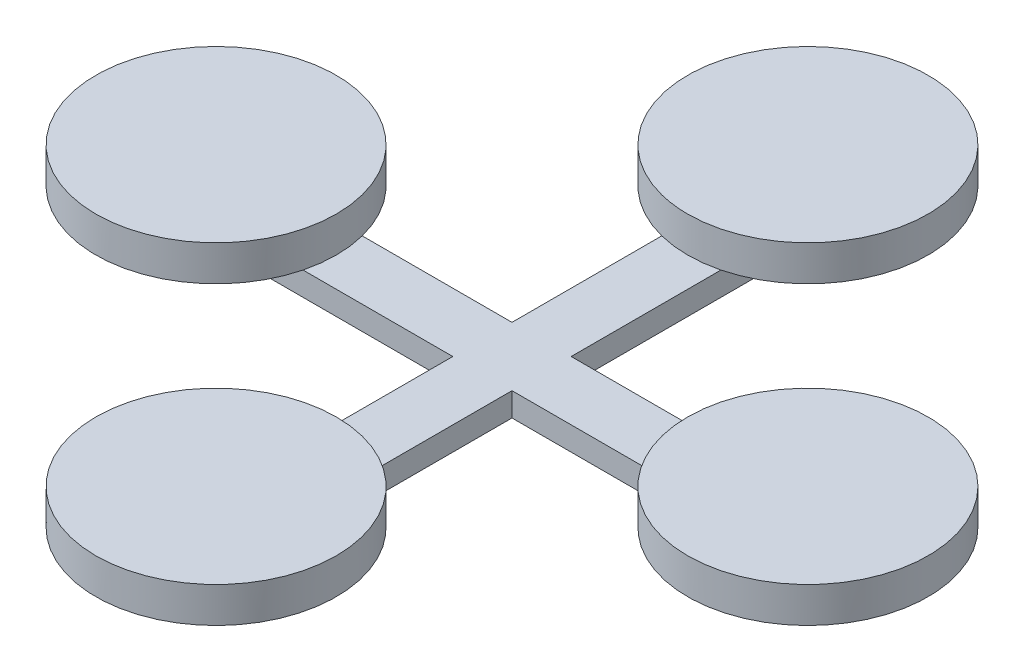
ISO-10303-21;
HEADER;
FILE_DESCRIPTION(('STEP AP214'),'2;1');
FILE_NAME('part.step','',(''),(''),'','','');
FILE_SCHEMA(('AUTOMOTIVE_DESIGN { 1 0 10303 214 1 1 1 1 }'));
ENDSEC;
DATA;
#1=APPLICATION_CONTEXT('core data for automotive mechanical design processes');
#2=APPLICATION_PROTOCOL_DEFINITION('international standard','automotive_design',2000,#1);
#3=PRODUCT_CONTEXT('',#1,'mechanical');
#4=PRODUCT('Part','Part','',(#3));
#5=PRODUCT_RELATED_PRODUCT_CATEGORY('part','',(#4));
#6=PRODUCT_DEFINITION_FORMATION('','',#4);
#7=PRODUCT_DEFINITION_CONTEXT('part definition',#1,'design');
#8=PRODUCT_DEFINITION('design','',#6,#7);
#9=PRODUCT_DEFINITION_SHAPE('','',#8);
#10=(LENGTH_UNIT() NAMED_UNIT(*) SI_UNIT(.MILLI.,.METRE.));
#11=(NAMED_UNIT(*) PLANE_ANGLE_UNIT() SI_UNIT($,.RADIAN.));
#12=(NAMED_UNIT(*) SI_UNIT($,.STERADIAN.) SOLID_ANGLE_UNIT());
#13=UNCERTAINTY_MEASURE_WITH_UNIT(LENGTH_MEASURE(1.E-05),#10,'distance_accuracy_value','');
#14=(GEOMETRIC_REPRESENTATION_CONTEXT(3) GLOBAL_UNCERTAINTY_ASSIGNED_CONTEXT((#13)) GLOBAL_UNIT_ASSIGNED_CONTEXT((#10,
#11,#12)) REPRESENTATION_CONTEXT('',''));
#15=CARTESIAN_POINT('',(0.,0.,0.));
#16=DIRECTION('',(0.,0.,1.));
#17=DIRECTION('',(1.,0.,0.));
#18=AXIS2_PLACEMENT_3D('',#15,#16,#17);
#19=CARTESIAN_POINT('',(-12.5,10.,0.));
#20=DIRECTION('',(1.,0.,0.));
#21=DIRECTION('',(0.,0.,-1.));
#22=AXIS2_PLACEMENT_3D('',#19,#20,#21);
#23=PLANE('',#22);
#24=DIRECTION('',(0.,0.,1.));
#25=VECTOR('',#24,1.);
#26=CARTESIAN_POINT('',(-12.5,0.,0.));
#27=LINE('',#26,#25);
#28=CARTESIAN_POINT('',(-12.5,0.,-125.));
#29=VERTEX_POINT('',#28);
#30=CARTESIAN_POINT('',(-12.5,0.,-12.5));
#31=VERTEX_POINT('',#30);
#32=EDGE_CURVE('E227',#29,#31,#27,.T.);
#33=ORIENTED_EDGE('',*,*,#32,.T.);
#34=DIRECTION('',(0.,-1.,0.));
#35=VECTOR('',#34,1.);
#36=CARTESIAN_POINT('',(-12.5,10.,-12.5));
#37=LINE('',#36,#35);
#38=CARTESIAN_POINT('',(-12.5,10.,-12.5));
#39=VERTEX_POINT('',#38);
#40=EDGE_CURVE('E42',#39,#31,#37,.T.);
#41=ORIENTED_EDGE('',*,*,#40,.F.);
#42=DIRECTION('',(0.,0.,1.));
#43=VECTOR('',#42,1.);
#44=CARTESIAN_POINT('',(-12.5,10.,0.));
#45=LINE('',#44,#43);
#46=CARTESIAN_POINT('',(-12.5,10.,-75.761904992171));
#47=VERTEX_POINT('',#46);
#48=EDGE_CURVE('E172',#47,#39,#45,.T.);
#49=ORIENTED_EDGE('',*,*,#48,.F.);
#50=CARTESIAN_POINT('',(-12.5,10.,-125.));
#51=VERTEX_POINT('',#50);
#52=EDGE_CURVE('E176',#51,#47,#45,.T.);
#53=ORIENTED_EDGE('',*,*,#52,.F.);
#54=DIRECTION('',(0.,-1.,0.));
#55=VECTOR('',#54,1.);
#56=CARTESIAN_POINT('',(-12.5,10.,-125.));
#57=LINE('',#56,#55);
#58=EDGE_CURVE('E226',#51,#29,#57,.T.);
#59=ORIENTED_EDGE('',*,*,#58,.T.);
#60=EDGE_LOOP('',(#33,#41,#49,#53,#59));
#61=FACE_BOUND('',#60,.T.);
#62=ADVANCED_FACE('F39',(#61),#23,.F.);
#63=CARTESIAN_POINT('',(0.,10.,-12.5));
#64=DIRECTION('',(0.,0.,-1.));
#65=DIRECTION('',(-1.,0.,0.));
#66=AXIS2_PLACEMENT_3D('',#63,#64,#65);
#67=PLANE('',#66);
#68=DIRECTION('',(1.,0.,0.));
#69=VECTOR('',#68,1.);
#70=CARTESIAN_POINT('',(0.,0.,-12.5));
#71=LINE('',#70,#69);
#72=CARTESIAN_POINT('',(-125.,0.,-12.5));
#73=VERTEX_POINT('',#72);
#74=EDGE_CURVE('E231',#73,#31,#71,.T.);
#75=ORIENTED_EDGE('',*,*,#74,.F.);
#76=DIRECTION('',(0.,-1.,0.));
#77=VECTOR('',#76,1.);
#78=CARTESIAN_POINT('',(-125.,10.,-12.5));
#79=LINE('',#78,#77);
#80=CARTESIAN_POINT('',(-125.,10.,-12.5));
#81=VERTEX_POINT('',#80);
#82=EDGE_CURVE('E180',#81,#73,#79,.T.);
#83=ORIENTED_EDGE('',*,*,#82,.F.);
#84=DIRECTION('',(1.,0.,0.));
#85=VECTOR('',#84,1.);
#86=CARTESIAN_POINT('',(0.,10.,-12.5));
#87=LINE('',#86,#85);
#88=CARTESIAN_POINT('',(-75.7619049921706,10.,-12.5));
#89=VERTEX_POINT('',#88);
#90=EDGE_CURVE('E154',#81,#89,#87,.T.);
#91=ORIENTED_EDGE('',*,*,#90,.T.);
#92=EDGE_CURVE('E169',#89,#39,#87,.T.);
#93=ORIENTED_EDGE('',*,*,#92,.T.);
#94=ORIENTED_EDGE('',*,*,#40,.T.);
#95=EDGE_LOOP('',(#75,#83,#91,#93,#94));
#96=FACE_BOUND('',#95,.T.);
#97=ADVANCED_FACE('F179',(#96),#67,.T.);
#98=CARTESIAN_POINT('',(-125.,10.,0.));
#99=DIRECTION('',(1.,0.,0.));
#100=DIRECTION('',(0.,0.,-1.));
#101=AXIS2_PLACEMENT_3D('',#98,#99,#100);
#102=PLANE('',#101);
#103=DIRECTION('',(0.,0.,1.));
#104=VECTOR('',#103,1.);
#105=CARTESIAN_POINT('',(-125.,0.,0.));
#106=LINE('',#105,#104);
#107=CARTESIAN_POINT('',(-125.,0.,12.5));
#108=VERTEX_POINT('',#107);
#109=EDGE_CURVE('E236',#73,#108,#106,.T.);
#110=ORIENTED_EDGE('',*,*,#109,.T.);
#111=DIRECTION('',(0.,-1.,0.));
#112=VECTOR('',#111,1.);
#113=CARTESIAN_POINT('',(-125.,10.,12.5));
#114=LINE('',#113,#112);
#115=CARTESIAN_POINT('',(-125.,10.,12.5));
#116=VERTEX_POINT('',#115);
#117=EDGE_CURVE('E301',#116,#108,#114,.T.);
#118=ORIENTED_EDGE('',*,*,#117,.F.);
#119=DIRECTION('',(0.,0.,1.));
#120=VECTOR('',#119,1.);
#121=CARTESIAN_POINT('',(-125.,10.,0.));
#122=LINE('',#121,#120);
#123=EDGE_CURVE('E183',#81,#116,#122,.T.);
#124=ORIENTED_EDGE('',*,*,#123,.F.);
#125=ORIENTED_EDGE('',*,*,#82,.T.);
#126=EDGE_LOOP('',(#110,#118,#124,#125));
#127=FACE_BOUND('',#126,.T.);
#128=ADVANCED_FACE('F317',(#127),#102,.F.);
#129=CARTESIAN_POINT('',(0.,10.,12.5));
#130=DIRECTION('',(0.,0.,-1.));
#131=DIRECTION('',(-1.,0.,0.));
#132=AXIS2_PLACEMENT_3D('',#129,#130,#131);
#133=PLANE('',#132);
#134=DIRECTION('',(1.,0.,0.));
#135=VECTOR('',#134,1.);
#136=CARTESIAN_POINT('',(0.,0.,12.5));
#137=LINE('',#136,#135);
#138=CARTESIAN_POINT('',(-12.5,0.,12.5));
#139=VERTEX_POINT('',#138);
#140=EDGE_CURVE('E239',#108,#139,#137,.T.);
#141=ORIENTED_EDGE('',*,*,#140,.T.);
#142=DIRECTION('',(0.,-1.,0.));
#143=VECTOR('',#142,1.);
#144=CARTESIAN_POINT('',(-12.5,10.,12.5));
#145=LINE('',#144,#143);
#146=CARTESIAN_POINT('',(-12.5,10.,12.5));
#147=VERTEX_POINT('',#146);
#148=EDGE_CURVE('E297',#147,#139,#145,.T.);
#149=ORIENTED_EDGE('',*,*,#148,.F.);
#150=DIRECTION('',(1.,0.,0.));
#151=VECTOR('',#150,1.);
#152=CARTESIAN_POINT('',(0.,10.,12.5));
#153=LINE('',#152,#151);
#154=CARTESIAN_POINT('',(-75.7619049921713,10.,12.5));
#155=VERTEX_POINT('',#154);
#156=EDGE_CURVE('E185',#155,#147,#153,.T.);
#157=ORIENTED_EDGE('',*,*,#156,.F.);
#158=EDGE_CURVE('E157',#116,#155,#153,.T.);
#159=ORIENTED_EDGE('',*,*,#158,.F.);
#160=ORIENTED_EDGE('',*,*,#117,.T.);
#161=EDGE_LOOP('',(#141,#149,#157,#159,#160));
#162=FACE_BOUND('',#161,.T.);
#163=ADVANCED_FACE('F319',(#162),#133,.F.);
#164=CARTESIAN_POINT('',(-12.5,10.,0.));
#165=DIRECTION('',(1.,0.,0.));
#166=DIRECTION('',(0.,0.,-1.));
#167=AXIS2_PLACEMENT_3D('',#164,#165,#166);
#168=PLANE('',#167);
#169=DIRECTION('',(0.,0.,1.));
#170=VECTOR('',#169,1.);
#171=CARTESIAN_POINT('',(-12.5,0.,0.));
#172=LINE('',#171,#170);
#173=CARTESIAN_POINT('',(-12.5,0.,125.));
#174=VERTEX_POINT('',#173);
#175=EDGE_CURVE('E242',#139,#174,#172,.T.);
#176=ORIENTED_EDGE('',*,*,#175,.T.);
#177=DIRECTION('',(0.,-1.,0.));
#178=VECTOR('',#177,1.);
#179=CARTESIAN_POINT('',(-12.5,10.,125.));
#180=LINE('',#179,#178);
#181=CARTESIAN_POINT('',(-12.5,10.,125.));
#182=VERTEX_POINT('',#181);
#183=EDGE_CURVE('E293',#182,#174,#180,.T.);
#184=ORIENTED_EDGE('',*,*,#183,.F.);
#185=DIRECTION('',(0.,0.,1.));
#186=VECTOR('',#185,1.);
#187=CARTESIAN_POINT('',(-12.5,10.,0.));
#188=LINE('',#187,#186);
#189=CARTESIAN_POINT('',(-12.5,10.,75.7619049921761));
#190=VERTEX_POINT('',#189);
#191=EDGE_CURVE('E191',#190,#182,#188,.T.);
#192=ORIENTED_EDGE('',*,*,#191,.F.);
#193=EDGE_CURVE('E192',#147,#190,#188,.T.);
#194=ORIENTED_EDGE('',*,*,#193,.F.);
#195=ORIENTED_EDGE('',*,*,#148,.T.);
#196=EDGE_LOOP('',(#176,#184,#192,#194,#195));
#197=FACE_BOUND('',#196,.T.);
#198=ADVANCED_FACE('F392',(#197),#168,.F.);
#199=CARTESIAN_POINT('',(0.,10.,125.));
#200=DIRECTION('',(0.,0.,-1.));
#201=DIRECTION('',(-1.,0.,0.));
#202=AXIS2_PLACEMENT_3D('',#199,#200,#201);
#203=PLANE('',#202);
#204=DIRECTION('',(1.,0.,0.));
#205=VECTOR('',#204,1.);
#206=CARTESIAN_POINT('',(0.,0.,125.));
#207=LINE('',#206,#205);
#208=CARTESIAN_POINT('',(12.5,0.,125.));
#209=VERTEX_POINT('',#208);
#210=EDGE_CURVE('E245',#174,#209,#207,.T.);
#211=ORIENTED_EDGE('',*,*,#210,.T.);
#212=DIRECTION('',(0.,-1.,0.));
#213=VECTOR('',#212,1.);
#214=CARTESIAN_POINT('',(12.5,10.,125.));
#215=LINE('',#214,#213);
#216=CARTESIAN_POINT('',(12.5,10.,125.));
#217=VERTEX_POINT('',#216);
#218=EDGE_CURVE('E290',#217,#209,#215,.T.);
#219=ORIENTED_EDGE('',*,*,#218,.F.);
#220=DIRECTION('',(1.,0.,0.));
#221=VECTOR('',#220,1.);
#222=CARTESIAN_POINT('',(0.,10.,125.));
#223=LINE('',#222,#221);
#224=EDGE_CURVE('E196',#182,#217,#223,.T.);
#225=ORIENTED_EDGE('',*,*,#224,.F.);
#226=ORIENTED_EDGE('',*,*,#183,.T.);
#227=EDGE_LOOP('',(#211,#219,#225,#226));
#228=FACE_BOUND('',#227,.T.);
#229=ADVANCED_FACE('F387',(#228),#203,.F.);
#230=CARTESIAN_POINT('',(12.5,10.,0.));
#231=DIRECTION('',(1.,0.,0.));
#232=DIRECTION('',(0.,0.,-1.));
#233=AXIS2_PLACEMENT_3D('',#230,#231,#232);
#234=PLANE('',#233);
#235=DIRECTION('',(0.,0.,1.));
#236=VECTOR('',#235,1.);
#237=CARTESIAN_POINT('',(12.5,0.,0.));
#238=LINE('',#237,#236);
#239=CARTESIAN_POINT('',(12.5,0.,12.5));
#240=VERTEX_POINT('',#239);
#241=EDGE_CURVE('E249',#240,#209,#238,.T.);
#242=ORIENTED_EDGE('',*,*,#241,.F.);
#243=DIRECTION('',(0.,-1.,0.));
#244=VECTOR('',#243,1.);
#245=CARTESIAN_POINT('',(12.5,10.,12.5));
#246=LINE('',#245,#244);
#247=CARTESIAN_POINT('',(12.5,10.,12.5));
#248=VERTEX_POINT('',#247);
#249=EDGE_CURVE('E287',#248,#240,#246,.T.);
#250=ORIENTED_EDGE('',*,*,#249,.F.);
#251=DIRECTION('',(0.,0.,1.));
#252=VECTOR('',#251,1.);
#253=CARTESIAN_POINT('',(12.5,10.,0.));
#254=LINE('',#253,#252);
#255=CARTESIAN_POINT('',(12.5,10.,75.7619049921744));
#256=VERTEX_POINT('',#255);
#257=EDGE_CURVE('E200',#248,#256,#254,.T.);
#258=ORIENTED_EDGE('',*,*,#257,.T.);
#259=EDGE_CURVE('E199',#256,#217,#254,.T.);
#260=ORIENTED_EDGE('',*,*,#259,.T.);
#261=ORIENTED_EDGE('',*,*,#218,.T.);
#262=EDGE_LOOP('',(#242,#250,#258,#260,#261));
#263=FACE_BOUND('',#262,.T.);
#264=ADVANCED_FACE('F383',(#263),#234,.T.);
#265=CARTESIAN_POINT('',(0.,10.,12.5));
#266=DIRECTION('',(0.,0.,-1.));
#267=DIRECTION('',(-1.,0.,0.));
#268=AXIS2_PLACEMENT_3D('',#265,#266,#267);
#269=PLANE('',#268);
#270=DIRECTION('',(1.,0.,0.));
#271=VECTOR('',#270,1.);
#272=CARTESIAN_POINT('',(0.,0.,12.5));
#273=LINE('',#272,#271);
#274=CARTESIAN_POINT('',(125.,0.,12.5));
#275=VERTEX_POINT('',#274);
#276=EDGE_CURVE('E253',#240,#275,#273,.T.);
#277=ORIENTED_EDGE('',*,*,#276,.T.);
#278=DIRECTION('',(0.,-1.,0.));
#279=VECTOR('',#278,1.);
#280=CARTESIAN_POINT('',(125.,10.,12.5));
#281=LINE('',#280,#279);
#282=CARTESIAN_POINT('',(125.,10.,12.5));
#283=VERTEX_POINT('',#282);
#284=EDGE_CURVE('E284',#283,#275,#281,.T.);
#285=ORIENTED_EDGE('',*,*,#284,.F.);
#286=DIRECTION('',(1.,0.,0.));
#287=VECTOR('',#286,1.);
#288=CARTESIAN_POINT('',(0.,10.,12.5));
#289=LINE('',#288,#287);
#290=CARTESIAN_POINT('',(75.7619049921709,10.,12.5));
#291=VERTEX_POINT('',#290);
#292=EDGE_CURVE('E204',#291,#283,#289,.T.);
#293=ORIENTED_EDGE('',*,*,#292,.F.);
#294=EDGE_CURVE('E205',#248,#291,#289,.T.);
#295=ORIENTED_EDGE('',*,*,#294,.F.);
#296=ORIENTED_EDGE('',*,*,#249,.T.);
#297=EDGE_LOOP('',(#277,#285,#293,#295,#296));
#298=FACE_BOUND('',#297,.T.);
#299=ADVANCED_FACE('F381',(#298),#269,.F.);
#300=CARTESIAN_POINT('',(125.,10.,0.));
#301=DIRECTION('',(1.,0.,0.));
#302=DIRECTION('',(0.,0.,-1.));
#303=AXIS2_PLACEMENT_3D('',#300,#301,#302);
#304=PLANE('',#303);
#305=DIRECTION('',(0.,0.,1.));
#306=VECTOR('',#305,1.);
#307=CARTESIAN_POINT('',(125.,0.,0.));
#308=LINE('',#307,#306);
#309=CARTESIAN_POINT('',(125.,0.,-12.5));
#310=VERTEX_POINT('',#309);
#311=EDGE_CURVE('E257',#310,#275,#308,.T.);
#312=ORIENTED_EDGE('',*,*,#311,.F.);
#313=DIRECTION('',(0.,-1.,0.));
#314=VECTOR('',#313,1.);
#315=CARTESIAN_POINT('',(125.,10.,-12.5));
#316=LINE('',#315,#314);
#317=CARTESIAN_POINT('',(125.,10.,-12.5));
#318=VERTEX_POINT('',#317);
#319=EDGE_CURVE('E281',#318,#310,#316,.T.);
#320=ORIENTED_EDGE('',*,*,#319,.F.);
#321=DIRECTION('',(0.,0.,1.));
#322=VECTOR('',#321,1.);
#323=CARTESIAN_POINT('',(125.,10.,0.));
#324=LINE('',#323,#322);
#325=EDGE_CURVE('E209',#318,#283,#324,.T.);
#326=ORIENTED_EDGE('',*,*,#325,.T.);
#327=ORIENTED_EDGE('',*,*,#284,.T.);
#328=EDGE_LOOP('',(#312,#320,#326,#327));
#329=FACE_BOUND('',#328,.T.);
#330=ADVANCED_FACE('F378',(#329),#304,.T.);
#331=CARTESIAN_POINT('',(0.,10.,-12.5));
#332=DIRECTION('',(0.,0.,-1.));
#333=DIRECTION('',(-1.,0.,0.));
#334=AXIS2_PLACEMENT_3D('',#331,#332,#333);
#335=PLANE('',#334);
#336=DIRECTION('',(1.,0.,0.));
#337=VECTOR('',#336,1.);
#338=CARTESIAN_POINT('',(0.,0.,-12.5));
#339=LINE('',#338,#337);
#340=CARTESIAN_POINT('',(12.5,0.,-12.5));
#341=VERTEX_POINT('',#340);
#342=EDGE_CURVE('E261',#341,#310,#339,.T.);
#343=ORIENTED_EDGE('',*,*,#342,.F.);
#344=DIRECTION('',(0.,-1.,0.));
#345=VECTOR('',#344,1.);
#346=CARTESIAN_POINT('',(12.5,10.,-12.5));
#347=LINE('',#346,#345);
#348=CARTESIAN_POINT('',(12.5,10.,-12.5));
#349=VERTEX_POINT('',#348);
#350=EDGE_CURVE('E278',#349,#341,#347,.T.);
#351=ORIENTED_EDGE('',*,*,#350,.F.);
#352=DIRECTION('',(1.,0.,0.));
#353=VECTOR('',#352,1.);
#354=CARTESIAN_POINT('',(0.,10.,-12.5));
#355=LINE('',#354,#353);
#356=CARTESIAN_POINT('',(75.7619049921711,10.,-12.5));
#357=VERTEX_POINT('',#356);
#358=EDGE_CURVE('E214',#349,#357,#355,.T.);
#359=ORIENTED_EDGE('',*,*,#358,.T.);
#360=EDGE_CURVE('E213',#357,#318,#355,.T.);
#361=ORIENTED_EDGE('',*,*,#360,.T.);
#362=ORIENTED_EDGE('',*,*,#319,.T.);
#363=EDGE_LOOP('',(#343,#351,#359,#361,#362));
#364=FACE_BOUND('',#363,.T.);
#365=ADVANCED_FACE('F339',(#364),#335,.T.);
#366=CARTESIAN_POINT('',(12.5,10.,0.));
#367=DIRECTION('',(1.,0.,0.));
#368=DIRECTION('',(0.,0.,-1.));
#369=AXIS2_PLACEMENT_3D('',#366,#367,#368);
#370=PLANE('',#369);
#371=DIRECTION('',(0.,0.,1.));
#372=VECTOR('',#371,1.);
#373=CARTESIAN_POINT('',(12.5,0.,0.));
#374=LINE('',#373,#372);
#375=CARTESIAN_POINT('',(12.5,0.,-125.));
#376=VERTEX_POINT('',#375);
#377=EDGE_CURVE('E265',#376,#341,#374,.T.);
#378=ORIENTED_EDGE('',*,*,#377,.F.);
#379=DIRECTION('',(0.,-1.,0.));
#380=VECTOR('',#379,1.);
#381=CARTESIAN_POINT('',(12.5,10.,-125.));
#382=LINE('',#381,#380);
#383=CARTESIAN_POINT('',(12.5,10.,-125.));
#384=VERTEX_POINT('',#383);
#385=EDGE_CURVE('E275',#384,#376,#382,.T.);
#386=ORIENTED_EDGE('',*,*,#385,.F.);
#387=DIRECTION('',(0.,0.,1.));
#388=VECTOR('',#387,1.);
#389=CARTESIAN_POINT('',(12.5,10.,0.));
#390=LINE('',#389,#388);
#391=CARTESIAN_POINT('',(12.5,10.,-75.761904992171));
#392=VERTEX_POINT('',#391);
#393=EDGE_CURVE('E219',#384,#392,#390,.T.);
#394=ORIENTED_EDGE('',*,*,#393,.T.);
#395=EDGE_CURVE('E218',#392,#349,#390,.T.);
#396=ORIENTED_EDGE('',*,*,#395,.T.);
#397=ORIENTED_EDGE('',*,*,#350,.T.);
#398=EDGE_LOOP('',(#378,#386,#394,#396,#397));
#399=FACE_BOUND('',#398,.T.);
#400=ADVANCED_FACE('F334',(#399),#370,.T.);
#401=CARTESIAN_POINT('',(0.,10.,-125.));
#402=DIRECTION('',(0.,0.,-1.));
#403=DIRECTION('',(-1.,0.,0.));
#404=AXIS2_PLACEMENT_3D('',#401,#402,#403);
#405=PLANE('',#404);
#406=DIRECTION('',(1.,0.,0.));
#407=VECTOR('',#406,1.);
#408=CARTESIAN_POINT('',(0.,0.,-125.));
#409=LINE('',#408,#407);
#410=EDGE_CURVE('E269',#29,#376,#409,.T.);
#411=ORIENTED_EDGE('',*,*,#410,.F.);
#412=ORIENTED_EDGE('',*,*,#58,.F.);
#413=DIRECTION('',(1.,0.,0.));
#414=VECTOR('',#413,1.);
#415=CARTESIAN_POINT('',(0.,10.,-125.));
#416=LINE('',#415,#414);
#417=EDGE_CURVE('E222',#51,#384,#416,.T.);
#418=ORIENTED_EDGE('',*,*,#417,.T.);
#419=ORIENTED_EDGE('',*,*,#385,.T.);
#420=EDGE_LOOP('',(#411,#412,#418,#419));
#421=FACE_BOUND('',#420,.T.);
#422=ADVANCED_FACE('F372',(#421),#405,.T.);
#423=CARTESIAN_POINT('',(0.,10.,0.));
#424=DIRECTION('',(0.,1.,0.));
#425=DIRECTION('',(0.,0.,1.));
#426=AXIS2_PLACEMENT_3D('',#423,#424,#425);
#427=PLANE('',#426);
#428=ORIENTED_EDGE('',*,*,#92,.F.);
#429=CARTESIAN_POINT('',(-125.,10.,-1.31971384292204E-12));
#430=DIRECTION('',(0.,1.,0.));
#431=DIRECTION('',(0.,0.,1.));
#432=AXIS2_PLACEMENT_3D('',#429,#430,#431);
#433=CIRCLE('',#432,50.8);
#434=EDGE_CURVE('E160',#155,#89,#433,.T.);
#435=ORIENTED_EDGE('',*,*,#434,.F.);
#436=ORIENTED_EDGE('',*,*,#156,.T.);
#437=ORIENTED_EDGE('',*,*,#193,.T.);
#438=CARTESIAN_POINT('',(3.47209495431294E-12,10.,125.));
#439=DIRECTION('',(0.,1.,0.));
#440=DIRECTION('',(0.,0.,1.));
#441=AXIS2_PLACEMENT_3D('',#438,#439,#440);
#442=CIRCLE('',#441,50.7999999999959);
#443=EDGE_CURVE('E394',#256,#190,#442,.T.);
#444=ORIENTED_EDGE('',*,*,#443,.F.);
#445=ORIENTED_EDGE('',*,*,#257,.F.);
#446=ORIENTED_EDGE('',*,*,#294,.T.);
#447=CARTESIAN_POINT('',(125.,10.,4.32965720403438E-13));
#448=DIRECTION('',(0.,1.,0.));
#449=DIRECTION('',(0.,0.,1.));
#450=AXIS2_PLACEMENT_3D('',#447,#448,#449);
#451=CIRCLE('',#450,50.8);
#452=EDGE_CURVE('E342',#357,#291,#451,.T.);
#453=ORIENTED_EDGE('',*,*,#452,.F.);
#454=ORIENTED_EDGE('',*,*,#358,.F.);
#455=ORIENTED_EDGE('',*,*,#395,.F.);
#456=CARTESIAN_POINT('',(0.,10.,-125.));
#457=DIRECTION('',(0.,1.,0.));
#458=DIRECTION('',(0.,0.,1.));
#459=AXIS2_PLACEMENT_3D('',#456,#457,#458);
#460=CIRCLE('',#459,50.8);
#461=EDGE_CURVE('E11',#47,#392,#460,.T.);
#462=ORIENTED_EDGE('',*,*,#461,.F.);
#463=ORIENTED_EDGE('',*,*,#48,.T.);
#464=EDGE_LOOP('',(#428,#435,#436,#437,#444,#445,#446,#453,#454,#455,#462,#463));
#465=FACE_BOUND('',#464,.T.);
#466=ADVANCED_FACE('F170',(#465),#427,.T.);
#467=CARTESIAN_POINT('',(0.,0.,0.));
#468=DIRECTION('',(0.,1.,0.));
#469=DIRECTION('',(0.,0.,1.));
#470=AXIS2_PLACEMENT_3D('',#467,#468,#469);
#471=PLANE('',#470);
#472=ORIENTED_EDGE('',*,*,#32,.F.);
#473=ORIENTED_EDGE('',*,*,#410,.T.);
#474=ORIENTED_EDGE('',*,*,#377,.T.);
#475=ORIENTED_EDGE('',*,*,#342,.T.);
#476=ORIENTED_EDGE('',*,*,#311,.T.);
#477=ORIENTED_EDGE('',*,*,#276,.F.);
#478=ORIENTED_EDGE('',*,*,#241,.T.);
#479=ORIENTED_EDGE('',*,*,#210,.F.);
#480=ORIENTED_EDGE('',*,*,#175,.F.);
#481=ORIENTED_EDGE('',*,*,#140,.F.);
#482=ORIENTED_EDGE('',*,*,#109,.F.);
#483=ORIENTED_EDGE('',*,*,#74,.T.);
#484=EDGE_LOOP('',(#472,#473,#474,#475,#476,#477,#478,#479,#480,#481,#482,#483));
#485=FACE_BOUND('',#484,.T.);
#486=ADVANCED_FACE('F313',(#485),#471,.F.);
#487=CARTESIAN_POINT('',(0.,10.,-125.));
#488=DIRECTION('',(0.,1.,0.));
#489=DIRECTION('',(0.,0.,1.));
#490=AXIS2_PLACEMENT_3D('',#487,#488,#489);
#491=PLANE('',#490);
#492=ORIENTED_EDGE('',*,*,#417,.F.);
#493=ORIENTED_EDGE('',*,*,#52,.T.);
#494=EDGE_CURVE('E49',#392,#47,#460,.T.);
#495=ORIENTED_EDGE('',*,*,#494,.F.);
#496=ORIENTED_EDGE('',*,*,#393,.F.);
#497=EDGE_LOOP('',(#492,#493,#495,#496));
#498=FACE_BOUND('',#497,.T.);
#499=ADVANCED_FACE('F368',(#498),#491,.F.);
#500=CARTESIAN_POINT('',(0.,25.,-125.));
#501=DIRECTION('',(0.,-1.,0.));
#502=DIRECTION('',(0.,0.,-1.));
#503=AXIS2_PLACEMENT_3D('',#500,#501,#502);
#504=CYLINDRICAL_SURFACE('',#503,50.8);
#505=CARTESIAN_POINT('',(0.,25.,-125.));
#506=DIRECTION('',(0.,1.,0.));
#507=DIRECTION('',(0.,0.,1.));
#508=AXIS2_PLACEMENT_3D('',#505,#506,#507);
#509=CIRCLE('',#508,50.8);
#510=CARTESIAN_POINT('',(0.,25.,-74.2));
#511=VERTEX_POINT('',#510);
#512=EDGE_CURVE('E232',#511,#511,#509,.T.);
#513=ORIENTED_EDGE('',*,*,#512,.F.);
#514=EDGE_LOOP('',(#513));
#515=FACE_BOUND('',#514,.T.);
#516=ORIENTED_EDGE('',*,*,#494,.T.);
#517=ORIENTED_EDGE('',*,*,#461,.T.);
#518=EDGE_LOOP('',(#516,#517));
#519=FACE_BOUND('',#518,.T.);
#520=ADVANCED_FACE('F364',(#515,#519),#504,.T.);
#521=CARTESIAN_POINT('',(0.,25.,-125.));
#522=DIRECTION('',(0.,1.,0.));
#523=DIRECTION('',(0.,0.,1.));
#524=AXIS2_PLACEMENT_3D('',#521,#522,#523);
#525=PLANE('',#524);
#526=ORIENTED_EDGE('',*,*,#512,.T.);
#527=EDGE_LOOP('',(#526));
#528=FACE_BOUND('',#527,.T.);
#529=ADVANCED_FACE('F452',(#528),#525,.T.);
#530=CARTESIAN_POINT('',(125.,10.,4.32965720403438E-13));
#531=DIRECTION('',(0.,1.,0.));
#532=DIRECTION('',(0.,0.,1.));
#533=AXIS2_PLACEMENT_3D('',#530,#531,#532);
#534=PLANE('',#533);
#535=EDGE_CURVE('E349',#291,#357,#451,.T.);
#536=ORIENTED_EDGE('',*,*,#535,.F.);
#537=ORIENTED_EDGE('',*,*,#292,.T.);
#538=ORIENTED_EDGE('',*,*,#325,.F.);
#539=ORIENTED_EDGE('',*,*,#360,.F.);
#540=EDGE_LOOP('',(#536,#537,#538,#539));
#541=FACE_BOUND('',#540,.T.);
#542=ADVANCED_FACE('F458',(#541),#534,.F.);
#543=CARTESIAN_POINT('',(125.,25.,4.32965720403438E-13));
#544=DIRECTION('',(0.,-1.,0.));
#545=DIRECTION('',(0.,0.,-1.));
#546=AXIS2_PLACEMENT_3D('',#543,#544,#545);
#547=CYLINDRICAL_SURFACE('',#546,50.8);
#548=CARTESIAN_POINT('',(125.,25.,4.32965720403438E-13));
#549=DIRECTION('',(0.,1.,0.));
#550=DIRECTION('',(0.,0.,1.));
#551=AXIS2_PLACEMENT_3D('',#548,#549,#550);
#552=CIRCLE('',#551,50.8);
#553=CARTESIAN_POINT('',(125.,25.,50.8000000000004));
#554=VERTEX_POINT('',#553);
#555=EDGE_CURVE('E348',#554,#554,#552,.T.);
#556=ORIENTED_EDGE('',*,*,#555,.F.);
#557=EDGE_LOOP('',(#556));
#558=FACE_BOUND('',#557,.T.);
#559=ORIENTED_EDGE('',*,*,#452,.T.);
#560=ORIENTED_EDGE('',*,*,#535,.T.);
#561=EDGE_LOOP('',(#559,#560));
#562=FACE_BOUND('',#561,.T.);
#563=ADVANCED_FACE('F460',(#558,#562),#547,.T.);
#564=CARTESIAN_POINT('',(125.,25.,4.32965720403438E-13));
#565=DIRECTION('',(0.,1.,0.));
#566=DIRECTION('',(0.,0.,1.));
#567=AXIS2_PLACEMENT_3D('',#564,#565,#566);
#568=PLANE('',#567);
#569=ORIENTED_EDGE('',*,*,#555,.T.);
#570=EDGE_LOOP('',(#569));
#571=FACE_BOUND('',#570,.T.);
#572=ADVANCED_FACE('F463',(#571),#568,.T.);
#573=CARTESIAN_POINT('',(3.47209495431294E-12,10.,125.));
#574=DIRECTION('',(0.,1.,0.));
#575=DIRECTION('',(0.,0.,1.));
#576=AXIS2_PLACEMENT_3D('',#573,#574,#575);
#577=PLANE('',#576);
#578=EDGE_CURVE('E62',#190,#256,#442,.T.);
#579=ORIENTED_EDGE('',*,*,#578,.F.);
#580=ORIENTED_EDGE('',*,*,#191,.T.);
#581=ORIENTED_EDGE('',*,*,#224,.T.);
#582=ORIENTED_EDGE('',*,*,#259,.F.);
#583=EDGE_LOOP('',(#579,#580,#581,#582));
#584=FACE_BOUND('',#583,.T.);
#585=ADVANCED_FACE('F470',(#584),#577,.F.);
#586=CARTESIAN_POINT('',(3.47209495431294E-12,25.,125.));
#587=DIRECTION('',(0.,-1.,0.));
#588=DIRECTION('',(0.,0.,-1.));
#589=AXIS2_PLACEMENT_3D('',#586,#587,#588);
#590=CYLINDRICAL_SURFACE('',#589,50.7999999999959);
#591=CARTESIAN_POINT('',(3.47209495431294E-12,25.,125.));
#592=DIRECTION('',(0.,1.,0.));
#593=DIRECTION('',(0.,0.,1.));
#594=AXIS2_PLACEMENT_3D('',#591,#592,#593);
#595=CIRCLE('',#594,50.7999999999959);
#596=CARTESIAN_POINT('',(3.47209495431294E-12,25.,175.799999999996));
#597=VERTEX_POINT('',#596);
#598=EDGE_CURVE('E355',#597,#597,#595,.T.);
#599=ORIENTED_EDGE('',*,*,#598,.F.);
#600=EDGE_LOOP('',(#599));
#601=FACE_BOUND('',#600,.T.);
#602=ORIENTED_EDGE('',*,*,#443,.T.);
#603=ORIENTED_EDGE('',*,*,#578,.T.);
#604=EDGE_LOOP('',(#602,#603));
#605=FACE_BOUND('',#604,.T.);
#606=ADVANCED_FACE('F415',(#601,#605),#590,.T.);
#607=CARTESIAN_POINT('',(3.47209495431294E-12,25.,125.));
#608=DIRECTION('',(0.,1.,0.));
#609=DIRECTION('',(0.,0.,1.));
#610=AXIS2_PLACEMENT_3D('',#607,#608,#609);
#611=PLANE('',#610);
#612=ORIENTED_EDGE('',*,*,#598,.T.);
#613=EDGE_LOOP('',(#612));
#614=FACE_BOUND('',#613,.T.);
#615=ADVANCED_FACE('F408',(#614),#611,.T.);
#616=CARTESIAN_POINT('',(-125.,25.,-1.31971384292204E-12));
#617=DIRECTION('',(0.,-1.,0.));
#618=DIRECTION('',(0.,0.,-1.));
#619=AXIS2_PLACEMENT_3D('',#616,#617,#618);
#620=CYLINDRICAL_SURFACE('',#619,50.8);
#621=CARTESIAN_POINT('',(-125.,25.,-1.31971384292204E-12));
#622=DIRECTION('',(0.,1.,0.));
#623=DIRECTION('',(0.,0.,1.));
#624=AXIS2_PLACEMENT_3D('',#621,#622,#623);
#625=CIRCLE('',#624,50.8);
#626=CARTESIAN_POINT('',(-125.,25.,50.7999999999987));
#627=VERTEX_POINT('',#626);
#628=EDGE_CURVE('E167',#627,#627,#625,.T.);
#629=ORIENTED_EDGE('',*,*,#628,.F.);
#630=EDGE_LOOP('',(#629));
#631=FACE_BOUND('',#630,.T.);
#632=ORIENTED_EDGE('',*,*,#434,.T.);
#633=EDGE_CURVE('E55',#89,#155,#433,.T.);
#634=ORIENTED_EDGE('',*,*,#633,.T.);
#635=EDGE_LOOP('',(#632,#634));
#636=FACE_BOUND('',#635,.T.);
#637=ADVANCED_FACE('F163',(#631,#636),#620,.T.);
#638=CARTESIAN_POINT('',(-125.,25.,-1.31971384292204E-12));
#639=DIRECTION('',(0.,1.,0.));
#640=DIRECTION('',(0.,0.,1.));
#641=AXIS2_PLACEMENT_3D('',#638,#639,#640);
#642=PLANE('',#641);
#643=ORIENTED_EDGE('',*,*,#628,.T.);
#644=EDGE_LOOP('',(#643));
#645=FACE_BOUND('',#644,.T.);
#646=ADVANCED_FACE('F405',(#645),#642,.T.);
#647=CARTESIAN_POINT('',(-125.,10.,-1.31971384292204E-12));
#648=DIRECTION('',(0.,1.,0.));
#649=DIRECTION('',(0.,0.,1.));
#650=AXIS2_PLACEMENT_3D('',#647,#648,#649);
#651=PLANE('',#650);
#652=ORIENTED_EDGE('',*,*,#90,.F.);
#653=ORIENTED_EDGE('',*,*,#123,.T.);
#654=ORIENTED_EDGE('',*,*,#158,.T.);
#655=ORIENTED_EDGE('',*,*,#633,.F.);
#656=EDGE_LOOP('',(#652,#653,#654,#655));
#657=FACE_BOUND('',#656,.T.);
#658=ADVANCED_FACE('F152',(#657),#651,.F.);
#659=CLOSED_SHELL('',(#62,#97,#128,#163,#198,#229,#264,#299,#330,#365,#400,#422,#466,#486,#499,
#520,#529,#542,#563,#572,#585,#606,#615,#637,#646,#658));
#660=MANIFOLD_SOLID_BREP('B2',#659);
#661=ADVANCED_BREP_SHAPE_REPRESENTATION('',(#18,#660),#14);
#662=SHAPE_DEFINITION_REPRESENTATION(#9,#661);
ENDSEC;
END-ISO-10303-21;
